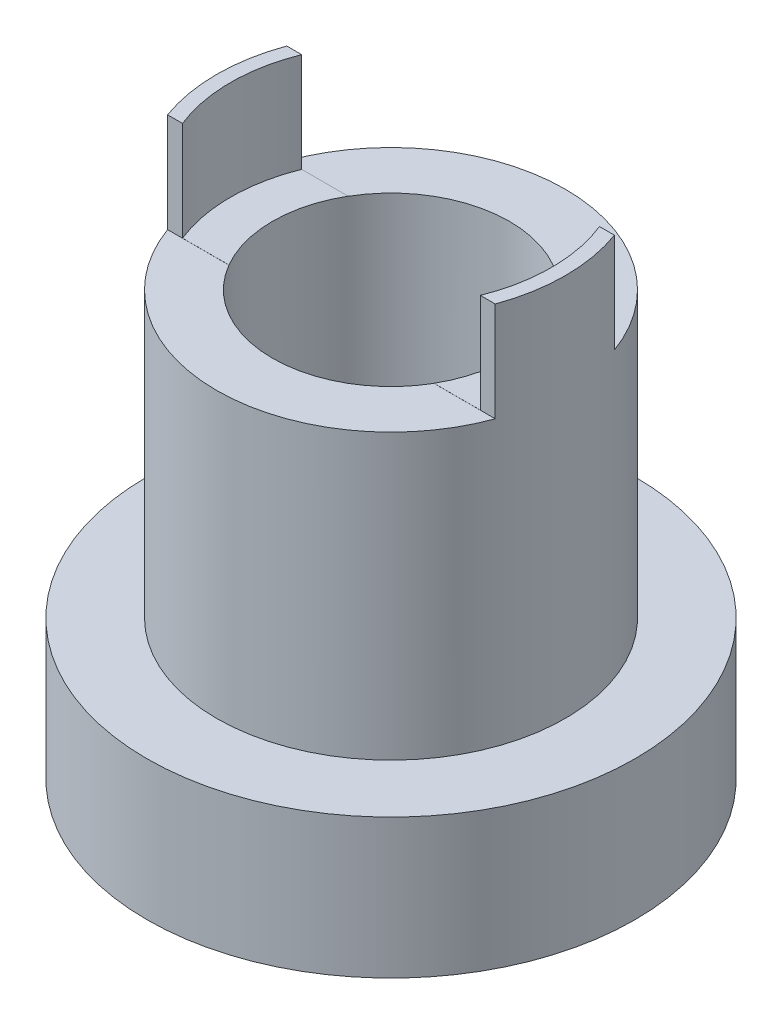
ISO-10303-21;
HEADER;
FILE_DESCRIPTION(('STEP AP214'),'2;1');
FILE_NAME('part.step','',(''),(''),'','','');
FILE_SCHEMA(('AUTOMOTIVE_DESIGN { 1 0 10303 214 1 1 1 1 }'));
ENDSEC;
DATA;
#1=APPLICATION_CONTEXT('core data for automotive mechanical design processes');
#2=APPLICATION_PROTOCOL_DEFINITION('international standard','automotive_design',2000,#1);
#3=PRODUCT_CONTEXT('',#1,'mechanical');
#4=PRODUCT('Part','Part','',(#3));
#5=PRODUCT_RELATED_PRODUCT_CATEGORY('part','',(#4));
#6=PRODUCT_DEFINITION_FORMATION('','',#4);
#7=PRODUCT_DEFINITION_CONTEXT('part definition',#1,'design');
#8=PRODUCT_DEFINITION('design','',#6,#7);
#9=PRODUCT_DEFINITION_SHAPE('','',#8);
#10=(LENGTH_UNIT() NAMED_UNIT(*) SI_UNIT(.MILLI.,.METRE.));
#11=(NAMED_UNIT(*) PLANE_ANGLE_UNIT() SI_UNIT($,.RADIAN.));
#12=(NAMED_UNIT(*) SI_UNIT($,.STERADIAN.) SOLID_ANGLE_UNIT());
#13=UNCERTAINTY_MEASURE_WITH_UNIT(LENGTH_MEASURE(1.E-05),#10,'distance_accuracy_value','');
#14=(GEOMETRIC_REPRESENTATION_CONTEXT(3) GLOBAL_UNCERTAINTY_ASSIGNED_CONTEXT((#13)) GLOBAL_UNIT_ASSIGNED_CONTEXT((#10,
#11,#12)) REPRESENTATION_CONTEXT('',''));
#15=CARTESIAN_POINT('',(0.,0.,0.));
#16=DIRECTION('',(0.,0.,1.));
#17=DIRECTION('',(1.,0.,0.));
#18=AXIS2_PLACEMENT_3D('',#15,#16,#17);
#19=CARTESIAN_POINT('',(0.,15.,0.));
#20=DIRECTION('',(0.,1.,0.));
#21=DIRECTION('',(0.,0.,1.));
#22=AXIS2_PLACEMENT_3D('',#19,#20,#21);
#23=CYLINDRICAL_SURFACE('',#22,3.4);
#24=CARTESIAN_POINT('',(0.,0.,0.));
#25=DIRECTION('',(0.,1.,0.));
#26=DIRECTION('',(0.,0.,1.));
#27=AXIS2_PLACEMENT_3D('',#24,#25,#26);
#28=CIRCLE('',#27,3.4);
#29=CARTESIAN_POINT('',(0.,0.,3.4));
#30=VERTEX_POINT('',#29);
#31=EDGE_CURVE('E158',#30,#30,#28,.T.);
#32=ORIENTED_EDGE('',*,*,#31,.F.);
#33=EDGE_LOOP('',(#32));
#34=FACE_BOUND('',#33,.T.);
#35=CARTESIAN_POINT('',(0.,12.15,0.));
#36=DIRECTION('',(0.,1.,0.));
#37=DIRECTION('',(0.,0.,1.));
#38=AXIS2_PLACEMENT_3D('',#35,#36,#37);
#39=CIRCLE('',#38,3.4);
#40=CARTESIAN_POINT('',(-2.9393133786235,12.15,1.70892857142857));
#41=VERTEX_POINT('',#40);
#42=CARTESIAN_POINT('',(-2.9393133786235,12.15,-1.70892857142856));
#43=VERTEX_POINT('',#42);
#44=EDGE_CURVE('E242',#41,#43,#39,.F.);
#45=ORIENTED_EDGE('',*,*,#44,.F.);
#46=DIRECTION('',(0.,1.,0.));
#47=VECTOR('',#46,1.);
#48=CARTESIAN_POINT('',(-2.9393133786235,15.,1.70892857142857));
#49=LINE('',#48,#47);
#50=CARTESIAN_POINT('',(-2.9393133786235,12.1475310362425,1.70892857142857));
#51=VERTEX_POINT('',#50);
#52=EDGE_CURVE('E192',#41,#51,#49,.F.);
#53=ORIENTED_EDGE('',*,*,#52,.T.);
#54=CARTESIAN_POINT('',(0.,12.1475310362426,0.));
#55=DIRECTION('',(0.,-1.,0.));
#56=DIRECTION('',(1.,0.,0.));
#57=AXIS2_PLACEMENT_3D('',#54,#55,#56);
#58=CIRCLE('',#57,3.4);
#59=CARTESIAN_POINT('',(2.9393133786235,12.1475310362426,1.70892857142857));
#60=VERTEX_POINT('',#59);
#61=EDGE_CURVE('E186',#51,#60,#58,.F.);
#62=ORIENTED_EDGE('',*,*,#61,.T.);
#63=DIRECTION('',(0.,1.,0.));
#64=VECTOR('',#63,1.);
#65=CARTESIAN_POINT('',(2.9393133786235,15.,1.70892857142857));
#66=LINE('',#65,#64);
#67=CARTESIAN_POINT('',(2.9393133786235,12.15,1.70892857142857));
#68=VERTEX_POINT('',#67);
#69=EDGE_CURVE('E189',#60,#68,#66,.T.);
#70=ORIENTED_EDGE('',*,*,#69,.T.);
#71=CARTESIAN_POINT('',(2.9393133786235,12.15,-1.70892857142856));
#72=VERTEX_POINT('',#71);
#73=EDGE_CURVE('E59',#72,#68,#39,.F.);
#74=ORIENTED_EDGE('',*,*,#73,.F.);
#75=DIRECTION('',(0.,1.,0.));
#76=VECTOR('',#75,1.);
#77=CARTESIAN_POINT('',(2.9393133786235,15.,-1.70892857142856));
#78=LINE('',#77,#76);
#79=CARTESIAN_POINT('',(2.9393133786235,12.1475310362426,-1.70892857142856));
#80=VERTEX_POINT('',#79);
#81=EDGE_CURVE('E184',#72,#80,#78,.F.);
#82=ORIENTED_EDGE('',*,*,#81,.T.);
#83=CARTESIAN_POINT('',(0.,12.1475310362426,0.));
#84=DIRECTION('',(0.,-1.,0.));
#85=DIRECTION('',(1.,0.,0.));
#86=AXIS2_PLACEMENT_3D('',#83,#84,#85);
#87=CIRCLE('',#86,3.4);
#88=CARTESIAN_POINT('',(-2.9393133786235,12.1475310362426,-1.70892857142856));
#89=VERTEX_POINT('',#88);
#90=EDGE_CURVE('E181',#80,#89,#87,.F.);
#91=ORIENTED_EDGE('',*,*,#90,.T.);
#92=DIRECTION('',(0.,1.,0.));
#93=VECTOR('',#92,1.);
#94=CARTESIAN_POINT('',(-2.9393133786235,15.,-1.70892857142856));
#95=LINE('',#94,#93);
#96=EDGE_CURVE('E173',#89,#43,#95,.T.);
#97=ORIENTED_EDGE('',*,*,#96,.T.);
#98=EDGE_LOOP('',(#45,#53,#62,#70,#74,#82,#91,#97));
#99=FACE_BOUND('',#98,.T.);
#100=ADVANCED_FACE('F36',(#34,#99),#23,.F.);
#101=CARTESIAN_POINT('',(0.,15.,0.));
#102=DIRECTION('',(0.,1.,0.));
#103=DIRECTION('',(0.,0.,1.));
#104=AXIS2_PLACEMENT_3D('',#101,#102,#103);
#105=PLANE('',#104);
#106=CARTESIAN_POINT('',(0.,15.,0.));
#107=DIRECTION('',(0.,1.,0.));
#108=DIRECTION('',(0.,0.,1.));
#109=AXIS2_PLACEMENT_3D('',#106,#107,#108);
#110=CIRCLE('',#109,4.6);
#111=CARTESIAN_POINT('',(4.27078015563376,15.,1.70892857142857));
#112=VERTEX_POINT('',#111);
#113=CARTESIAN_POINT('',(4.27078015563376,15.,-1.70892857142856));
#114=VERTEX_POINT('',#113);
#115=EDGE_CURVE('E126',#112,#114,#110,.T.);
#116=ORIENTED_EDGE('',*,*,#115,.F.);
#117=DIRECTION('',(-1.,0.,0.));
#118=VECTOR('',#117,1.);
#119=CARTESIAN_POINT('',(0.,15.,1.70892857142857));
#120=LINE('',#119,#118);
#121=CARTESIAN_POINT('',(4.69888956432848,15.,1.70892857142857));
#122=VERTEX_POINT('',#121);
#123=EDGE_CURVE('E137',#122,#112,#120,.T.);
#124=ORIENTED_EDGE('',*,*,#123,.F.);
#125=CARTESIAN_POINT('',(0.,15.,0.));
#126=DIRECTION('',(0.,1.,0.));
#127=DIRECTION('',(0.,0.,1.));
#128=AXIS2_PLACEMENT_3D('',#125,#126,#127);
#129=CIRCLE('',#128,5.);
#130=CARTESIAN_POINT('',(4.69888956432848,15.,-1.70892857142856));
#131=VERTEX_POINT('',#130);
#132=EDGE_CURVE('E167',#122,#131,#129,.T.);
#133=ORIENTED_EDGE('',*,*,#132,.T.);
#134=DIRECTION('',(1.,0.,0.));
#135=VECTOR('',#134,1.);
#136=CARTESIAN_POINT('',(0.,15.,-1.70892857142856));
#137=LINE('',#136,#135);
#138=EDGE_CURVE('E139',#114,#131,#137,.T.);
#139=ORIENTED_EDGE('',*,*,#138,.F.);
#140=EDGE_LOOP('',(#116,#124,#133,#139));
#141=FACE_BOUND('',#140,.T.);
#142=ADVANCED_FACE('F135',(#141),#105,.T.);
#143=CARTESIAN_POINT('',(0.,4.,0.));
#144=DIRECTION('',(0.,-1.,0.));
#145=DIRECTION('',(0.,0.,-1.));
#146=AXIS2_PLACEMENT_3D('',#143,#144,#145);
#147=CYLINDRICAL_SURFACE('',#146,7.);
#148=CARTESIAN_POINT('',(0.,4.,0.));
#149=DIRECTION('',(0.,1.,0.));
#150=DIRECTION('',(0.,0.,1.));
#151=AXIS2_PLACEMENT_3D('',#148,#149,#150);
#152=CIRCLE('',#151,7.);
#153=CARTESIAN_POINT('',(0.,4.,7.));
#154=VERTEX_POINT('',#153);
#155=EDGE_CURVE('E174',#154,#154,#152,.T.);
#156=ORIENTED_EDGE('',*,*,#155,.F.);
#157=EDGE_LOOP('',(#156));
#158=FACE_BOUND('',#157,.T.);
#159=CARTESIAN_POINT('',(0.,0.,0.));
#160=DIRECTION('',(0.,1.,0.));
#161=DIRECTION('',(0.,0.,1.));
#162=AXIS2_PLACEMENT_3D('',#159,#160,#161);
#163=CIRCLE('',#162,7.);
#164=CARTESIAN_POINT('',(0.,0.,7.));
#165=VERTEX_POINT('',#164);
#166=EDGE_CURVE('E169',#165,#165,#163,.T.);
#167=ORIENTED_EDGE('',*,*,#166,.T.);
#168=EDGE_LOOP('',(#167));
#169=FACE_BOUND('',#168,.T.);
#170=ADVANCED_FACE('F38',(#158,#169),#147,.T.);
#171=CARTESIAN_POINT('',(0.,4.,0.));
#172=DIRECTION('',(0.,1.,0.));
#173=DIRECTION('',(0.,0.,1.));
#174=AXIS2_PLACEMENT_3D('',#171,#172,#173);
#175=PLANE('',#174);
#176=CARTESIAN_POINT('',(0.,4.,0.));
#177=DIRECTION('',(0.,1.,0.));
#178=DIRECTION('',(0.,0.,1.));
#179=AXIS2_PLACEMENT_3D('',#176,#177,#178);
#180=CIRCLE('',#179,5.);
#181=CARTESIAN_POINT('',(0.,4.,5.));
#182=VERTEX_POINT('',#181);
#183=EDGE_CURVE('E170',#182,#182,#180,.T.);
#184=ORIENTED_EDGE('',*,*,#183,.F.);
#185=EDGE_LOOP('',(#184));
#186=FACE_BOUND('',#185,.T.);
#187=ORIENTED_EDGE('',*,*,#155,.T.);
#188=EDGE_LOOP('',(#187));
#189=FACE_BOUND('',#188,.T.);
#190=ADVANCED_FACE('F284',(#186,#189),#175,.T.);
#191=CARTESIAN_POINT('',(0.,0.,0.));
#192=DIRECTION('',(0.,1.,0.));
#193=DIRECTION('',(0.,0.,1.));
#194=AXIS2_PLACEMENT_3D('',#191,#192,#193);
#195=PLANE('',#194);
#196=ORIENTED_EDGE('',*,*,#31,.T.);
#197=EDGE_LOOP('',(#196));
#198=FACE_BOUND('',#197,.T.);
#199=ORIENTED_EDGE('',*,*,#166,.F.);
#200=EDGE_LOOP('',(#199));
#201=FACE_BOUND('',#200,.T.);
#202=ADVANCED_FACE('F283',(#198,#201),#195,.F.);
#203=CARTESIAN_POINT('',(0.,15.,0.));
#204=DIRECTION('',(0.,-1.,0.));
#205=DIRECTION('',(0.,0.,-1.));
#206=AXIS2_PLACEMENT_3D('',#203,#204,#205);
#207=CYLINDRICAL_SURFACE('',#206,5.);
#208=ORIENTED_EDGE('',*,*,#132,.F.);
#209=DIRECTION('',(0.,-1.,0.));
#210=VECTOR('',#209,1.);
#211=CARTESIAN_POINT('',(4.69888956432848,15.,1.70892857142857));
#212=LINE('',#211,#210);
#213=CARTESIAN_POINT('',(4.69888956432848,12.1475310362426,1.70892857142857));
#214=VERTEX_POINT('',#213);
#215=EDGE_CURVE('E145',#122,#214,#212,.T.);
#216=ORIENTED_EDGE('',*,*,#215,.T.);
#217=CARTESIAN_POINT('',(0.,12.1475310362426,0.));
#218=DIRECTION('',(0.,-1.,0.));
#219=DIRECTION('',(1.,0.,0.));
#220=AXIS2_PLACEMENT_3D('',#217,#218,#219);
#221=CIRCLE('',#220,5.);
#222=CARTESIAN_POINT('',(-4.69888956432848,12.1475310362425,1.70892857142857));
#223=VERTEX_POINT('',#222);
#224=EDGE_CURVE('E146',#214,#223,#221,.T.);
#225=ORIENTED_EDGE('',*,*,#224,.T.);
#226=DIRECTION('',(0.,-1.,0.));
#227=VECTOR('',#226,1.);
#228=CARTESIAN_POINT('',(-4.69888956432848,15.,1.70892857142857));
#229=LINE('',#228,#227);
#230=CARTESIAN_POINT('',(-4.69888956432848,15.,1.70892857142857));
#231=VERTEX_POINT('',#230);
#232=EDGE_CURVE('E153',#223,#231,#229,.F.);
#233=ORIENTED_EDGE('',*,*,#232,.T.);
#234=CARTESIAN_POINT('',(-4.69888956432848,15.,-1.70892857142856));
#235=VERTEX_POINT('',#234);
#236=EDGE_CURVE('E164',#235,#231,#129,.T.);
#237=ORIENTED_EDGE('',*,*,#236,.F.);
#238=DIRECTION('',(0.,-1.,0.));
#239=VECTOR('',#238,1.);
#240=CARTESIAN_POINT('',(-4.69888956432848,15.,-1.70892857142856));
#241=LINE('',#240,#239);
#242=CARTESIAN_POINT('',(-4.69888956432848,12.1475310362425,-1.70892857142856));
#243=VERTEX_POINT('',#242);
#244=EDGE_CURVE('E212',#235,#243,#241,.T.);
#245=ORIENTED_EDGE('',*,*,#244,.T.);
#246=CARTESIAN_POINT('',(0.,12.1475310362426,0.));
#247=DIRECTION('',(0.,-1.,0.));
#248=DIRECTION('',(1.,0.,0.));
#249=AXIS2_PLACEMENT_3D('',#246,#247,#248);
#250=CIRCLE('',#249,5.);
#251=CARTESIAN_POINT('',(4.69888956432848,12.1475310362426,-1.70892857142856));
#252=VERTEX_POINT('',#251);
#253=EDGE_CURVE('E151',#243,#252,#250,.T.);
#254=ORIENTED_EDGE('',*,*,#253,.T.);
#255=DIRECTION('',(0.,-1.,0.));
#256=VECTOR('',#255,1.);
#257=CARTESIAN_POINT('',(4.69888956432848,15.,-1.70892857142856));
#258=LINE('',#257,#256);
#259=EDGE_CURVE('E224',#252,#131,#258,.F.);
#260=ORIENTED_EDGE('',*,*,#259,.T.);
#261=EDGE_LOOP('',(#208,#216,#225,#233,#237,#245,#254,#260));
#262=FACE_BOUND('',#261,.T.);
#263=ORIENTED_EDGE('',*,*,#183,.T.);
#264=EDGE_LOOP('',(#263));
#265=FACE_BOUND('',#264,.T.);
#266=ADVANCED_FACE('F228',(#262,#265),#207,.T.);
#267=CARTESIAN_POINT('',(-4.27078015563376,15.,-1.70892857142856));
#268=VERTEX_POINT('',#267);
#269=CARTESIAN_POINT('',(-4.27078015563376,15.,1.70892857142857));
#270=VERTEX_POINT('',#269);
#271=EDGE_CURVE('E140',#268,#270,#110,.T.);
#272=ORIENTED_EDGE('',*,*,#271,.F.);
#273=EDGE_CURVE('E209',#235,#268,#137,.T.);
#274=ORIENTED_EDGE('',*,*,#273,.F.);
#275=ORIENTED_EDGE('',*,*,#236,.T.);
#276=EDGE_CURVE('E148',#270,#231,#120,.T.);
#277=ORIENTED_EDGE('',*,*,#276,.F.);
#278=EDGE_LOOP('',(#272,#274,#275,#277));
#279=FACE_BOUND('',#278,.T.);
#280=ADVANCED_FACE('F259',(#279),#105,.T.);
#281=CARTESIAN_POINT('',(-7.00000000000009,12.1475310362425,-1.70892857142856));
#282=DIRECTION('',(0.,-1.,0.));
#283=DIRECTION('',(1.,0.,0.));
#284=AXIS2_PLACEMENT_3D('',#281,#282,#283);
#285=PLANE('',#284);
#286=DIRECTION('',(1.,0.,0.));
#287=VECTOR('',#286,1.);
#288=CARTESIAN_POINT('',(-7.00000000000009,12.1475310362425,-1.70892857142856));
#289=LINE('',#288,#287);
#290=EDGE_CURVE('E214',#243,#89,#289,.T.);
#291=ORIENTED_EDGE('',*,*,#290,.T.);
#292=ORIENTED_EDGE('',*,*,#90,.F.);
#293=EDGE_CURVE('E219',#80,#252,#289,.T.);
#294=ORIENTED_EDGE('',*,*,#293,.T.);
#295=ORIENTED_EDGE('',*,*,#253,.F.);
#296=EDGE_LOOP('',(#291,#292,#294,#295));
#297=FACE_BOUND('',#296,.T.);
#298=ADVANCED_FACE('F233',(#297),#285,.F.);
#299=CARTESIAN_POINT('',(-7.0000000000001,15.0475310362425,-1.70892857142856));
#300=DIRECTION('',(0.,0.,1.));
#301=DIRECTION('',(1.,0.,0.));
#302=AXIS2_PLACEMENT_3D('',#299,#300,#301);
#303=PLANE('',#302);
#304=DIRECTION('',(-1.,0.,0.));
#305=VECTOR('',#304,1.);
#306=CARTESIAN_POINT('',(-7.0000000000001,12.15,-1.70892857142856));
#307=LINE('',#306,#305);
#308=CARTESIAN_POINT('',(4.27078015563376,12.15,-1.70892857142856));
#309=VERTEX_POINT('',#308);
#310=EDGE_CURVE('E245',#309,#72,#307,.T.);
#311=ORIENTED_EDGE('',*,*,#310,.F.);
#312=DIRECTION('',(0.,1.,0.));
#313=VECTOR('',#312,1.);
#314=CARTESIAN_POINT('',(4.27078015563376,12.15,-1.70892857142856));
#315=LINE('',#314,#313);
#316=EDGE_CURVE('E217',#309,#114,#315,.T.);
#317=ORIENTED_EDGE('',*,*,#316,.T.);
#318=ORIENTED_EDGE('',*,*,#138,.T.);
#319=ORIENTED_EDGE('',*,*,#259,.F.);
#320=ORIENTED_EDGE('',*,*,#293,.F.);
#321=ORIENTED_EDGE('',*,*,#81,.F.);
#322=EDGE_LOOP('',(#311,#317,#318,#319,#320,#321));
#323=FACE_BOUND('',#322,.T.);
#324=ADVANCED_FACE('F244',(#323),#303,.F.);
#325=ORIENTED_EDGE('',*,*,#273,.T.);
#326=DIRECTION('',(0.,1.,0.));
#327=VECTOR('',#326,1.);
#328=CARTESIAN_POINT('',(-4.27078015563376,12.15,-1.70892857142856));
#329=LINE('',#328,#327);
#330=CARTESIAN_POINT('',(-4.27078015563376,12.15,-1.70892857142856));
#331=VERTEX_POINT('',#330);
#332=EDGE_CURVE('E246',#268,#331,#329,.F.);
#333=ORIENTED_EDGE('',*,*,#332,.T.);
#334=DIRECTION('',(-1.,0.,0.));
#335=VECTOR('',#334,1.);
#336=CARTESIAN_POINT('',(-7.0000000000001,12.15,-1.70892857142856));
#337=LINE('',#336,#335);
#338=EDGE_CURVE('E241',#43,#331,#337,.T.);
#339=ORIENTED_EDGE('',*,*,#338,.F.);
#340=ORIENTED_EDGE('',*,*,#96,.F.);
#341=ORIENTED_EDGE('',*,*,#290,.F.);
#342=ORIENTED_EDGE('',*,*,#244,.F.);
#343=EDGE_LOOP('',(#325,#333,#339,#340,#341,#342));
#344=FACE_BOUND('',#343,.T.);
#345=ADVANCED_FACE('F237',(#344),#303,.F.);
#346=CARTESIAN_POINT('',(-7.00000000000009,12.1475310362425,1.70892857142857));
#347=DIRECTION('',(0.,0.,-1.));
#348=DIRECTION('',(-1.,0.,0.));
#349=AXIS2_PLACEMENT_3D('',#346,#347,#348);
#350=PLANE('',#349);
#351=DIRECTION('',(1.,0.,0.));
#352=VECTOR('',#351,1.);
#353=CARTESIAN_POINT('',(-7.00000000000009,12.15,1.70892857142857));
#354=LINE('',#353,#352);
#355=CARTESIAN_POINT('',(-4.27078015563376,12.15,1.70892857142857));
#356=VERTEX_POINT('',#355);
#357=EDGE_CURVE('E251',#356,#41,#354,.T.);
#358=ORIENTED_EDGE('',*,*,#357,.F.);
#359=DIRECTION('',(0.,1.,0.));
#360=VECTOR('',#359,1.);
#361=CARTESIAN_POINT('',(-4.27078015563376,12.15,1.70892857142857));
#362=LINE('',#361,#360);
#363=EDGE_CURVE('E247',#356,#270,#362,.T.);
#364=ORIENTED_EDGE('',*,*,#363,.T.);
#365=ORIENTED_EDGE('',*,*,#276,.T.);
#366=ORIENTED_EDGE('',*,*,#232,.F.);
#367=DIRECTION('',(1.,0.,0.));
#368=VECTOR('',#367,1.);
#369=CARTESIAN_POINT('',(-7.00000000000009,12.1475310362425,1.70892857142857));
#370=LINE('',#369,#368);
#371=EDGE_CURVE('E205',#223,#51,#370,.T.);
#372=ORIENTED_EDGE('',*,*,#371,.T.);
#373=ORIENTED_EDGE('',*,*,#52,.F.);
#374=EDGE_LOOP('',(#358,#364,#365,#366,#372,#373));
#375=FACE_BOUND('',#374,.T.);
#376=ADVANCED_FACE('F208',(#375),#350,.F.);
#377=ORIENTED_EDGE('',*,*,#123,.T.);
#378=DIRECTION('',(0.,1.,0.));
#379=VECTOR('',#378,1.);
#380=CARTESIAN_POINT('',(4.27078015563376,12.15,1.70892857142857));
#381=LINE('',#380,#379);
#382=CARTESIAN_POINT('',(4.27078015563376,12.15,1.70892857142857));
#383=VERTEX_POINT('',#382);
#384=EDGE_CURVE('E11',#112,#383,#381,.F.);
#385=ORIENTED_EDGE('',*,*,#384,.T.);
#386=DIRECTION('',(1.,0.,0.));
#387=VECTOR('',#386,1.);
#388=CARTESIAN_POINT('',(-7.00000000000009,12.15,1.70892857142857));
#389=LINE('',#388,#387);
#390=EDGE_CURVE('E44',#68,#383,#389,.T.);
#391=ORIENTED_EDGE('',*,*,#390,.F.);
#392=ORIENTED_EDGE('',*,*,#69,.F.);
#393=EDGE_CURVE('E206',#60,#214,#370,.T.);
#394=ORIENTED_EDGE('',*,*,#393,.T.);
#395=ORIENTED_EDGE('',*,*,#215,.F.);
#396=EDGE_LOOP('',(#377,#385,#391,#392,#394,#395));
#397=FACE_BOUND('',#396,.T.);
#398=ADVANCED_FACE('F142',(#397),#350,.F.);
#399=CARTESIAN_POINT('',(-7.00000000000009,12.1475310362425,1.70892857142857));
#400=DIRECTION('',(0.,-1.,0.));
#401=DIRECTION('',(1.,0.,0.));
#402=AXIS2_PLACEMENT_3D('',#399,#400,#401);
#403=PLANE('',#402);
#404=ORIENTED_EDGE('',*,*,#393,.F.);
#405=ORIENTED_EDGE('',*,*,#61,.F.);
#406=ORIENTED_EDGE('',*,*,#371,.F.);
#407=ORIENTED_EDGE('',*,*,#224,.F.);
#408=EDGE_LOOP('',(#404,#405,#406,#407));
#409=FACE_BOUND('',#408,.T.);
#410=ADVANCED_FACE('F204',(#409),#403,.F.);
#411=CARTESIAN_POINT('',(0.,12.15,0.));
#412=DIRECTION('',(0.,1.,0.));
#413=DIRECTION('',(0.,0.,1.));
#414=AXIS2_PLACEMENT_3D('',#411,#412,#413);
#415=PLANE('',#414);
#416=ORIENTED_EDGE('',*,*,#310,.T.);
#417=ORIENTED_EDGE('',*,*,#73,.T.);
#418=ORIENTED_EDGE('',*,*,#390,.T.);
#419=CARTESIAN_POINT('',(0.,12.15,0.));
#420=DIRECTION('',(0.,1.,0.));
#421=DIRECTION('',(0.,0.,1.));
#422=AXIS2_PLACEMENT_3D('',#419,#420,#421);
#423=CIRCLE('',#422,4.6);
#424=EDGE_CURVE('E129',#383,#309,#423,.T.);
#425=ORIENTED_EDGE('',*,*,#424,.T.);
#426=EDGE_LOOP('',(#416,#417,#418,#425));
#427=FACE_BOUND('',#426,.T.);
#428=ADVANCED_FACE('F193',(#427),#415,.T.);
#429=CARTESIAN_POINT('',(0.,12.15,0.));
#430=DIRECTION('',(0.,1.,0.));
#431=DIRECTION('',(0.,0.,1.));
#432=AXIS2_PLACEMENT_3D('',#429,#430,#431);
#433=CYLINDRICAL_SURFACE('',#432,4.6);
#434=ORIENTED_EDGE('',*,*,#424,.F.);
#435=ORIENTED_EDGE('',*,*,#384,.F.);
#436=ORIENTED_EDGE('',*,*,#115,.T.);
#437=ORIENTED_EDGE('',*,*,#316,.F.);
#438=EDGE_LOOP('',(#434,#435,#436,#437));
#439=FACE_BOUND('',#438,.T.);
#440=ADVANCED_FACE('F125',(#439),#433,.F.);
#441=ORIENTED_EDGE('',*,*,#271,.T.);
#442=ORIENTED_EDGE('',*,*,#363,.F.);
#443=EDGE_CURVE('E51',#331,#356,#423,.T.);
#444=ORIENTED_EDGE('',*,*,#443,.F.);
#445=ORIENTED_EDGE('',*,*,#332,.F.);
#446=EDGE_LOOP('',(#441,#442,#444,#445));
#447=FACE_BOUND('',#446,.T.);
#448=ADVANCED_FACE('F260',(#447),#433,.F.);
#449=ORIENTED_EDGE('',*,*,#338,.T.);
#450=ORIENTED_EDGE('',*,*,#443,.T.);
#451=ORIENTED_EDGE('',*,*,#357,.T.);
#452=ORIENTED_EDGE('',*,*,#44,.T.);
#453=EDGE_LOOP('',(#449,#450,#451,#452));
#454=FACE_BOUND('',#453,.T.);
#455=ADVANCED_FACE('F255',(#454),#415,.T.);
#456=CLOSED_SHELL('',(#100,#142,#170,#190,#202,#266,#280,#298,#324,#345,#376,#398,#410,#428,
#440,#448,#455));
#457=MANIFOLD_SOLID_BREP('B2',#456);
#458=ADVANCED_BREP_SHAPE_REPRESENTATION('',(#18,#457),#14);
#459=SHAPE_DEFINITION_REPRESENTATION(#9,#458);
ENDSEC;
END-ISO-10303-21;
